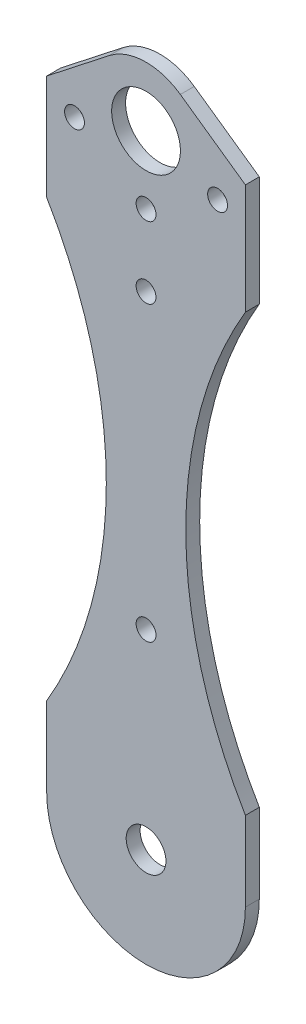
ISO-10303-21;
HEADER;
FILE_DESCRIPTION(('STEP AP214'),'2;1');
FILE_NAME('part.step','',(''),(''),'','','');
FILE_SCHEMA(('AUTOMOTIVE_DESIGN { 1 0 10303 214 1 1 1 1 }'));
ENDSEC;
DATA;
#1=APPLICATION_CONTEXT('core data for automotive mechanical design processes');
#2=APPLICATION_PROTOCOL_DEFINITION('international standard','automotive_design',2000,#1);
#3=PRODUCT_CONTEXT('',#1,'mechanical');
#4=PRODUCT('Part','Part','',(#3));
#5=PRODUCT_RELATED_PRODUCT_CATEGORY('part','',(#4));
#6=PRODUCT_DEFINITION_FORMATION('','',#4);
#7=PRODUCT_DEFINITION_CONTEXT('part definition',#1,'design');
#8=PRODUCT_DEFINITION('design','',#6,#7);
#9=PRODUCT_DEFINITION_SHAPE('','',#8);
#10=(LENGTH_UNIT() NAMED_UNIT(*) SI_UNIT(.MILLI.,.METRE.));
#11=(NAMED_UNIT(*) PLANE_ANGLE_UNIT() SI_UNIT($,.RADIAN.));
#12=(NAMED_UNIT(*) SI_UNIT($,.STERADIAN.) SOLID_ANGLE_UNIT());
#13=UNCERTAINTY_MEASURE_WITH_UNIT(LENGTH_MEASURE(1.E-05),#10,'distance_accuracy_value','');
#14=(GEOMETRIC_REPRESENTATION_CONTEXT(3) GLOBAL_UNCERTAINTY_ASSIGNED_CONTEXT((#13)) GLOBAL_UNIT_ASSIGNED_CONTEXT((#10,
#11,#12)) REPRESENTATION_CONTEXT('',''));
#15=CARTESIAN_POINT('',(0.,0.,0.));
#16=DIRECTION('',(0.,0.,1.));
#17=DIRECTION('',(1.,0.,0.));
#18=AXIS2_PLACEMENT_3D('',#15,#16,#17);
#19=CARTESIAN_POINT('',(-31.75,0.,4.445));
#20=DIRECTION('',(1.,0.,0.));
#21=DIRECTION('',(0.,1.,0.));
#22=AXIS2_PLACEMENT_3D('',#19,#20,#21);
#23=PLANE('',#22);
#24=DIRECTION('',(0.,0.,-1.));
#25=VECTOR('',#24,1.);
#26=CARTESIAN_POINT('',(-31.75,86.0944421154926,4.445));
#27=LINE('',#26,#25);
#28=CARTESIAN_POINT('',(-31.75,86.0944421154926,4.445));
#29=VERTEX_POINT('',#28);
#30=CARTESIAN_POINT('',(-31.75,86.0944421154926,0.));
#31=VERTEX_POINT('',#30);
#32=EDGE_CURVE('E255',#29,#31,#27,.T.);
#33=ORIENTED_EDGE('',*,*,#32,.T.);
#34=DIRECTION('',(0.,-1.,0.));
#35=VECTOR('',#34,1.);
#36=CARTESIAN_POINT('',(-31.75,0.,0.));
#37=LINE('',#36,#35);
#38=CARTESIAN_POINT('',(-31.75,52.48275,0.));
#39=VERTEX_POINT('',#38);
#40=EDGE_CURVE('E159',#31,#39,#37,.T.);
#41=ORIENTED_EDGE('',*,*,#40,.T.);
#42=DIRECTION('',(0.,0.,-1.));
#43=VECTOR('',#42,1.);
#44=CARTESIAN_POINT('',(-31.75,52.48275,4.445));
#45=LINE('',#44,#43);
#46=CARTESIAN_POINT('',(-31.75,52.48275,4.445));
#47=VERTEX_POINT('',#46);
#48=EDGE_CURVE('E116',#47,#39,#45,.T.);
#49=ORIENTED_EDGE('',*,*,#48,.F.);
#50=DIRECTION('',(0.,-1.,0.));
#51=VECTOR('',#50,1.);
#52=CARTESIAN_POINT('',(-31.75,0.,4.445));
#53=LINE('',#52,#51);
#54=EDGE_CURVE('E124',#29,#47,#53,.T.);
#55=ORIENTED_EDGE('',*,*,#54,.F.);
#56=EDGE_LOOP('',(#33,#41,#49,#55));
#57=FACE_BOUND('',#56,.T.);
#58=ADVANCED_FACE('F37',(#57),#23,.F.);
#59=CARTESIAN_POINT('',(31.75,0.,4.445));
#60=DIRECTION('',(1.,0.,0.));
#61=DIRECTION('',(0.,1.,0.));
#62=AXIS2_PLACEMENT_3D('',#59,#60,#61);
#63=PLANE('',#62);
#64=DIRECTION('',(0.,-1.,0.));
#65=VECTOR('',#64,1.);
#66=CARTESIAN_POINT('',(31.75,0.,0.));
#67=LINE('',#66,#65);
#68=CARTESIAN_POINT('',(31.75,-86.7727499999999,0.));
#69=VERTEX_POINT('',#68);
#70=CARTESIAN_POINT('',(31.75,-112.17275,0.));
#71=VERTEX_POINT('',#70);
#72=EDGE_CURVE('E152',#69,#71,#67,.T.);
#73=ORIENTED_EDGE('',*,*,#72,.F.);
#74=DIRECTION('',(0.,0.,-1.));
#75=VECTOR('',#74,1.);
#76=CARTESIAN_POINT('',(31.75,-86.7727499999999,4.445));
#77=LINE('',#76,#75);
#78=CARTESIAN_POINT('',(31.75,-86.7727499999999,4.445));
#79=VERTEX_POINT('',#78);
#80=EDGE_CURVE('E11',#79,#69,#77,.T.);
#81=ORIENTED_EDGE('',*,*,#80,.F.);
#82=DIRECTION('',(0.,-1.,0.));
#83=VECTOR('',#82,1.);
#84=CARTESIAN_POINT('',(31.75,0.,4.445));
#85=LINE('',#84,#83);
#86=CARTESIAN_POINT('',(31.75,-112.17275,4.445));
#87=VERTEX_POINT('',#86);
#88=EDGE_CURVE('E284',#79,#87,#85,.T.);
#89=ORIENTED_EDGE('',*,*,#88,.T.);
#90=DIRECTION('',(0.,0.,-1.));
#91=VECTOR('',#90,1.);
#92=CARTESIAN_POINT('',(31.75,-112.17275,4.445));
#93=LINE('',#92,#91);
#94=EDGE_CURVE('E87',#87,#71,#93,.T.);
#95=ORIENTED_EDGE('',*,*,#94,.T.);
#96=EDGE_LOOP('',(#73,#81,#89,#95));
#97=FACE_BOUND('',#96,.T.);
#98=ADVANCED_FACE('F183',(#97),#63,.T.);
#99=CARTESIAN_POINT('',(149.469713125,-17.1449999999999,4.445));
#100=DIRECTION('',(0.,0.,-1.));
#101=DIRECTION('',(-1.,0.,0.));
#102=AXIS2_PLACEMENT_3D('',#99,#100,#101);
#103=CYLINDRICAL_SURFACE('',#102,136.769713125);
#104=CARTESIAN_POINT('',(149.469713125,-17.1449999999999,0.));
#105=DIRECTION('',(0.,0.,1.));
#106=DIRECTION('',(1.,0.,0.));
#107=AXIS2_PLACEMENT_3D('',#104,#105,#106);
#108=CIRCLE('',#107,136.769713125);
#109=CARTESIAN_POINT('',(31.75,52.48275,0.));
#110=VERTEX_POINT('',#109);
#111=EDGE_CURVE('E155',#69,#110,#108,.F.);
#112=ORIENTED_EDGE('',*,*,#111,.T.);
#113=DIRECTION('',(0.,0.,-1.));
#114=VECTOR('',#113,1.);
#115=CARTESIAN_POINT('',(31.75,52.48275,4.445));
#116=LINE('',#115,#114);
#117=CARTESIAN_POINT('',(31.75,52.48275,4.445));
#118=VERTEX_POINT('',#117);
#119=EDGE_CURVE('E45',#118,#110,#116,.T.);
#120=ORIENTED_EDGE('',*,*,#119,.F.);
#121=CARTESIAN_POINT('',(149.469713125,-17.1449999999999,4.445));
#122=DIRECTION('',(0.,0.,1.));
#123=DIRECTION('',(1.,0.,0.));
#124=AXIS2_PLACEMENT_3D('',#121,#122,#123);
#125=CIRCLE('',#124,136.769713125);
#126=EDGE_CURVE('E285',#79,#118,#125,.F.);
#127=ORIENTED_EDGE('',*,*,#126,.F.);
#128=ORIENTED_EDGE('',*,*,#80,.T.);
#129=EDGE_LOOP('',(#112,#120,#127,#128));
#130=FACE_BOUND('',#129,.T.);
#131=ADVANCED_FACE('F179',(#130),#103,.F.);
#132=DIRECTION('',(0.,0.,-1.));
#133=VECTOR('',#132,1.);
#134=CARTESIAN_POINT('',(31.75,87.7278500626216,4.445));
#135=LINE('',#134,#133);
#136=CARTESIAN_POINT('',(31.75,87.7278500626216,4.445));
#137=VERTEX_POINT('',#136);
#138=CARTESIAN_POINT('',(31.75,87.7278500626216,0.));
#139=VERTEX_POINT('',#138);
#140=EDGE_CURVE('E238',#137,#139,#135,.T.);
#141=ORIENTED_EDGE('',*,*,#140,.F.);
#142=EDGE_CURVE('E132',#137,#118,#85,.T.);
#143=ORIENTED_EDGE('',*,*,#142,.T.);
#144=ORIENTED_EDGE('',*,*,#119,.T.);
#145=EDGE_CURVE('E156',#139,#110,#67,.T.);
#146=ORIENTED_EDGE('',*,*,#145,.F.);
#147=EDGE_LOOP('',(#141,#143,#144,#146));
#148=FACE_BOUND('',#147,.T.);
#149=ADVANCED_FACE('F173',(#148),#63,.T.);
#150=CARTESIAN_POINT('',(-149.469713125,-17.145,4.445));
#151=DIRECTION('',(0.,0.,-1.));
#152=DIRECTION('',(-1.,0.,0.));
#153=AXIS2_PLACEMENT_3D('',#150,#151,#152);
#154=CYLINDRICAL_SURFACE('',#153,136.769713125);
#155=CARTESIAN_POINT('',(-149.469713125,-17.145,0.));
#156=DIRECTION('',(0.,0.,1.));
#157=DIRECTION('',(1.,0.,0.));
#158=AXIS2_PLACEMENT_3D('',#155,#156,#157);
#159=CIRCLE('',#158,136.769713125);
#160=CARTESIAN_POINT('',(-31.75,-86.77275,0.));
#161=VERTEX_POINT('',#160);
#162=EDGE_CURVE('E112',#161,#39,#159,.T.);
#163=ORIENTED_EDGE('',*,*,#162,.F.);
#164=DIRECTION('',(0.,0.,-1.));
#165=VECTOR('',#164,1.);
#166=CARTESIAN_POINT('',(-31.75,-86.77275,4.445));
#167=LINE('',#166,#165);
#168=CARTESIAN_POINT('',(-31.75,-86.77275,4.445));
#169=VERTEX_POINT('',#168);
#170=EDGE_CURVE('E105',#169,#161,#167,.T.);
#171=ORIENTED_EDGE('',*,*,#170,.F.);
#172=CARTESIAN_POINT('',(-149.469713125,-17.145,4.445));
#173=DIRECTION('',(0.,0.,1.));
#174=DIRECTION('',(1.,0.,0.));
#175=AXIS2_PLACEMENT_3D('',#172,#173,#174);
#176=CIRCLE('',#175,136.769713125);
#177=EDGE_CURVE('E110',#169,#47,#176,.T.);
#178=ORIENTED_EDGE('',*,*,#177,.T.);
#179=ORIENTED_EDGE('',*,*,#48,.T.);
#180=EDGE_LOOP('',(#163,#171,#178,#179));
#181=FACE_BOUND('',#180,.T.);
#182=ADVANCED_FACE('F107',(#181),#154,.F.);
#183=CARTESIAN_POINT('',(-31.75,-112.17275,0.));
#184=VERTEX_POINT('',#183);
#185=EDGE_CURVE('E161',#161,#184,#37,.T.);
#186=ORIENTED_EDGE('',*,*,#185,.T.);
#187=DIRECTION('',(0.,0.,-1.));
#188=VECTOR('',#187,1.);
#189=CARTESIAN_POINT('',(-31.75,-112.17275,4.445));
#190=LINE('',#189,#188);
#191=CARTESIAN_POINT('',(-31.75,-112.17275,4.445));
#192=VERTEX_POINT('',#191);
#193=EDGE_CURVE('E117',#192,#184,#190,.T.);
#194=ORIENTED_EDGE('',*,*,#193,.F.);
#195=EDGE_CURVE('E120',#169,#192,#53,.T.);
#196=ORIENTED_EDGE('',*,*,#195,.F.);
#197=ORIENTED_EDGE('',*,*,#170,.T.);
#198=EDGE_LOOP('',(#186,#194,#196,#197));
#199=FACE_BOUND('',#198,.T.);
#200=ADVANCED_FACE('F121',(#199),#23,.F.);
#201=CARTESIAN_POINT('',(22.86,79.1527500000001,4.445));
#202=DIRECTION('',(0.,0.,-1.));
#203=DIRECTION('',(-1.,0.,0.));
#204=AXIS2_PLACEMENT_3D('',#201,#202,#203);
#205=CYLINDRICAL_SURFACE('',#204,3.175);
#206=CARTESIAN_POINT('',(22.86,79.1527500000001,4.445));
#207=DIRECTION('',(0.,0.,1.));
#208=DIRECTION('',(1.,0.,0.));
#209=AXIS2_PLACEMENT_3D('',#206,#207,#208);
#210=CIRCLE('',#209,3.175);
#211=CARTESIAN_POINT('',(26.035,79.1527500000001,4.445));
#212=VERTEX_POINT('',#211);
#213=EDGE_CURVE('E281',#212,#212,#210,.T.);
#214=ORIENTED_EDGE('',*,*,#213,.T.);
#215=EDGE_LOOP('',(#214));
#216=FACE_BOUND('',#215,.T.);
#217=CARTESIAN_POINT('',(22.86,79.1527500000001,0.));
#218=DIRECTION('',(0.,0.,1.));
#219=DIRECTION('',(1.,0.,0.));
#220=AXIS2_PLACEMENT_3D('',#217,#218,#219);
#221=CIRCLE('',#220,3.175);
#222=CARTESIAN_POINT('',(26.035,79.1527500000001,0.));
#223=VERTEX_POINT('',#222);
#224=EDGE_CURVE('E149',#223,#223,#221,.T.);
#225=ORIENTED_EDGE('',*,*,#224,.F.);
#226=EDGE_LOOP('',(#225));
#227=FACE_BOUND('',#226,.T.);
#228=ADVANCED_FACE('F201',(#216,#227),#205,.F.);
#229=CARTESIAN_POINT('',(-22.86,79.1527500000001,4.445));
#230=DIRECTION('',(0.,0.,-1.));
#231=DIRECTION('',(-1.,0.,0.));
#232=AXIS2_PLACEMENT_3D('',#229,#230,#231);
#233=CYLINDRICAL_SURFACE('',#232,3.175);
#234=CARTESIAN_POINT('',(-22.86,79.1527500000001,4.445));
#235=DIRECTION('',(0.,0.,1.));
#236=DIRECTION('',(1.,0.,0.));
#237=AXIS2_PLACEMENT_3D('',#234,#235,#236);
#238=CIRCLE('',#237,3.175);
#239=CARTESIAN_POINT('',(-19.685,79.1527500000001,4.445));
#240=VERTEX_POINT('',#239);
#241=EDGE_CURVE('E278',#240,#240,#238,.T.);
#242=ORIENTED_EDGE('',*,*,#241,.T.);
#243=EDGE_LOOP('',(#242));
#244=FACE_BOUND('',#243,.T.);
#245=CARTESIAN_POINT('',(-22.86,79.1527500000001,0.));
#246=DIRECTION('',(0.,0.,1.));
#247=DIRECTION('',(1.,0.,0.));
#248=AXIS2_PLACEMENT_3D('',#245,#246,#247);
#249=CIRCLE('',#248,3.175);
#250=CARTESIAN_POINT('',(-19.685,79.1527500000001,0.));
#251=VERTEX_POINT('',#250);
#252=EDGE_CURVE('E146',#251,#251,#249,.T.);
#253=ORIENTED_EDGE('',*,*,#252,.F.);
#254=EDGE_LOOP('',(#253));
#255=FACE_BOUND('',#254,.T.);
#256=ADVANCED_FACE('F305',(#244,#255),#233,.F.);
#257=CARTESIAN_POINT('',(0.,65.1827500000001,4.445));
#258=DIRECTION('',(0.,0.,-1.));
#259=DIRECTION('',(-1.,0.,0.));
#260=AXIS2_PLACEMENT_3D('',#257,#258,#259);
#261=CYLINDRICAL_SURFACE('',#260,3.175);
#262=CARTESIAN_POINT('',(0.,65.1827500000001,4.445));
#263=DIRECTION('',(0.,0.,1.));
#264=DIRECTION('',(1.,0.,0.));
#265=AXIS2_PLACEMENT_3D('',#262,#263,#264);
#266=CIRCLE('',#265,3.175);
#267=CARTESIAN_POINT('',(3.175,65.1827500000001,4.445));
#268=VERTEX_POINT('',#267);
#269=EDGE_CURVE('E275',#268,#268,#266,.T.);
#270=ORIENTED_EDGE('',*,*,#269,.T.);
#271=EDGE_LOOP('',(#270));
#272=FACE_BOUND('',#271,.T.);
#273=CARTESIAN_POINT('',(0.,65.1827500000001,0.));
#274=DIRECTION('',(0.,0.,1.));
#275=DIRECTION('',(1.,0.,0.));
#276=AXIS2_PLACEMENT_3D('',#273,#274,#275);
#277=CIRCLE('',#276,3.175);
#278=CARTESIAN_POINT('',(3.175,65.1827500000001,0.));
#279=VERTEX_POINT('',#278);
#280=EDGE_CURVE('E143',#279,#279,#277,.T.);
#281=ORIENTED_EDGE('',*,*,#280,.F.);
#282=EDGE_LOOP('',(#281));
#283=FACE_BOUND('',#282,.T.);
#284=ADVANCED_FACE('F312',(#272,#283),#261,.F.);
#285=CARTESIAN_POINT('',(0.,86.77275,4.445));
#286=DIRECTION('',(0.,0.,-1.));
#287=DIRECTION('',(-1.,0.,0.));
#288=AXIS2_PLACEMENT_3D('',#285,#286,#287);
#289=CYLINDRICAL_SURFACE('',#288,10.9855);
#290=CARTESIAN_POINT('',(0.,86.77275,4.445));
#291=DIRECTION('',(0.,0.,1.));
#292=DIRECTION('',(1.,0.,0.));
#293=AXIS2_PLACEMENT_3D('',#290,#291,#292);
#294=CIRCLE('',#293,10.9855);
#295=CARTESIAN_POINT('',(10.9855,86.77275,4.445));
#296=VERTEX_POINT('',#295);
#297=EDGE_CURVE('E272',#296,#296,#294,.T.);
#298=ORIENTED_EDGE('',*,*,#297,.T.);
#299=EDGE_LOOP('',(#298));
#300=FACE_BOUND('',#299,.T.);
#301=CARTESIAN_POINT('',(0.,86.77275,0.));
#302=DIRECTION('',(0.,0.,1.));
#303=DIRECTION('',(1.,0.,0.));
#304=AXIS2_PLACEMENT_3D('',#301,#302,#303);
#305=CIRCLE('',#304,10.9855);
#306=CARTESIAN_POINT('',(10.9855,86.77275,0.));
#307=VERTEX_POINT('',#306);
#308=EDGE_CURVE('E139',#307,#307,#305,.T.);
#309=ORIENTED_EDGE('',*,*,#308,.F.);
#310=EDGE_LOOP('',(#309));
#311=FACE_BOUND('',#310,.T.);
#312=ADVANCED_FACE('F317',(#300,#311),#289,.F.);
#313=CARTESIAN_POINT('',(0.,-112.17275,4.445));
#314=DIRECTION('',(0.,0.,-1.));
#315=DIRECTION('',(-1.,0.,0.));
#316=AXIS2_PLACEMENT_3D('',#313,#314,#315);
#317=CYLINDRICAL_SURFACE('',#316,6.35);
#318=CARTESIAN_POINT('',(0.,-112.17275,4.445));
#319=DIRECTION('',(0.,0.,1.));
#320=DIRECTION('',(1.,0.,0.));
#321=AXIS2_PLACEMENT_3D('',#318,#319,#320);
#322=CIRCLE('',#321,6.35);
#323=CARTESIAN_POINT('',(6.35000000000002,-112.17275,4.445));
#324=VERTEX_POINT('',#323);
#325=EDGE_CURVE('E165',#324,#324,#322,.T.);
#326=ORIENTED_EDGE('',*,*,#325,.T.);
#327=EDGE_LOOP('',(#326));
#328=FACE_BOUND('',#327,.T.);
#329=CARTESIAN_POINT('',(0.,-112.17275,0.));
#330=DIRECTION('',(0.,0.,1.));
#331=DIRECTION('',(1.,0.,0.));
#332=AXIS2_PLACEMENT_3D('',#329,#330,#331);
#333=CIRCLE('',#332,6.35);
#334=CARTESIAN_POINT('',(6.35000000000002,-112.17275,0.));
#335=VERTEX_POINT('',#334);
#336=EDGE_CURVE('E136',#335,#335,#333,.T.);
#337=ORIENTED_EDGE('',*,*,#336,.F.);
#338=EDGE_LOOP('',(#337));
#339=FACE_BOUND('',#338,.T.);
#340=ADVANCED_FACE('F39',(#328,#339),#317,.F.);
#341=CARTESIAN_POINT('',(0.,-112.17275,4.445));
#342=DIRECTION('',(0.,0.,-1.));
#343=DIRECTION('',(-1.,0.,0.));
#344=AXIS2_PLACEMENT_3D('',#341,#342,#343);
#345=CYLINDRICAL_SURFACE('',#344,31.75);
#346=CARTESIAN_POINT('',(0.,-112.17275,0.));
#347=DIRECTION('',(0.,0.,1.));
#348=DIRECTION('',(1.,0.,0.));
#349=AXIS2_PLACEMENT_3D('',#346,#347,#348);
#350=CIRCLE('',#349,31.75);
#351=EDGE_CURVE('E163',#184,#71,#350,.T.);
#352=ORIENTED_EDGE('',*,*,#351,.T.);
#353=ORIENTED_EDGE('',*,*,#94,.F.);
#354=CARTESIAN_POINT('',(0.,-112.17275,4.445));
#355=DIRECTION('',(0.,0.,1.));
#356=DIRECTION('',(1.,0.,0.));
#357=AXIS2_PLACEMENT_3D('',#354,#355,#356);
#358=CIRCLE('',#357,31.75);
#359=EDGE_CURVE('E61',#192,#87,#358,.T.);
#360=ORIENTED_EDGE('',*,*,#359,.F.);
#361=ORIENTED_EDGE('',*,*,#193,.T.);
#362=EDGE_LOOP('',(#352,#353,#360,#361));
#363=FACE_BOUND('',#362,.T.);
#364=ADVANCED_FACE('F203',(#363),#345,.T.);
#365=CARTESIAN_POINT('',(0.,0.,4.445));
#366=DIRECTION('',(0.,0.,1.));
#367=DIRECTION('',(1.,0.,0.));
#368=AXIS2_PLACEMENT_3D('',#365,#366,#367);
#369=PLANE('',#368);
#370=DIRECTION('',(-0.817874399318846,0.575396790865953,0.));
#371=VECTOR('',#370,1.);
#372=CARTESIAN_POINT('',(51.7967650011085,73.6244079467071,4.445));
#373=LINE('',#372,#371);
#374=CARTESIAN_POINT('',(10.9613088659964,102.353257307024,4.445));
#375=VERTEX_POINT('',#374);
#376=EDGE_CURVE('E249',#137,#375,#373,.T.);
#377=ORIENTED_EDGE('',*,*,#376,.T.);
#378=CARTESIAN_POINT('',(0.,86.77275,4.445));
#379=DIRECTION('',(0.,0.,-1.));
#380=DIRECTION('',(-1.,0.,0.));
#381=AXIS2_PLACEMENT_3D('',#378,#379,#380);
#382=CIRCLE('',#381,19.05);
#383=CARTESIAN_POINT('',(-11.7503407514417,101.767148695013,4.445));
#384=VERTEX_POINT('',#383);
#385=EDGE_CURVE('E240',#384,#375,#382,.T.);
#386=ORIENTED_EDGE('',*,*,#385,.F.);
#387=DIRECTION('',(0.787107543045302,0.616815787477257,0.));
#388=VECTOR('',#387,1.);
#389=CARTESIAN_POINT('',(-53.8785420272322,68.7534393556382,4.445));
#390=LINE('',#389,#388);
#391=EDGE_CURVE('E298',#29,#384,#390,.T.);
#392=ORIENTED_EDGE('',*,*,#391,.F.);
#393=ORIENTED_EDGE('',*,*,#54,.T.);
#394=ORIENTED_EDGE('',*,*,#177,.F.);
#395=ORIENTED_EDGE('',*,*,#195,.T.);
#396=ORIENTED_EDGE('',*,*,#359,.T.);
#397=ORIENTED_EDGE('',*,*,#88,.F.);
#398=ORIENTED_EDGE('',*,*,#126,.T.);
#399=ORIENTED_EDGE('',*,*,#142,.F.);
#400=EDGE_LOOP('',(#377,#386,#392,#393,#394,#395,#396,#397,#398,#399));
#401=FACE_BOUND('',#400,.T.);
#402=CARTESIAN_POINT('',(0.,-51.21275,4.445));
#403=DIRECTION('',(0.,0.,1.));
#404=DIRECTION('',(1.,0.,0.));
#405=AXIS2_PLACEMENT_3D('',#402,#403,#404);
#406=CIRCLE('',#405,3.175);
#407=CARTESIAN_POINT('',(3.175,-51.21275,4.445));
#408=VERTEX_POINT('',#407);
#409=EDGE_CURVE('E253',#408,#408,#406,.T.);
#410=ORIENTED_EDGE('',*,*,#409,.F.);
#411=EDGE_LOOP('',(#410));
#412=FACE_BOUND('',#411,.T.);
#413=CARTESIAN_POINT('',(0.,42.3227500000001,4.445));
#414=DIRECTION('',(0.,0.,1.));
#415=DIRECTION('',(1.,0.,0.));
#416=AXIS2_PLACEMENT_3D('',#413,#414,#415);
#417=CIRCLE('',#416,3.175);
#418=CARTESIAN_POINT('',(3.175,42.3227500000001,4.445));
#419=VERTEX_POINT('',#418);
#420=EDGE_CURVE('E263',#419,#419,#417,.T.);
#421=ORIENTED_EDGE('',*,*,#420,.F.);
#422=EDGE_LOOP('',(#421));
#423=FACE_BOUND('',#422,.T.);
#424=ORIENTED_EDGE('',*,*,#325,.F.);
#425=EDGE_LOOP('',(#424));
#426=FACE_BOUND('',#425,.T.);
#427=ORIENTED_EDGE('',*,*,#297,.F.);
#428=EDGE_LOOP('',(#427));
#429=FACE_BOUND('',#428,.T.);
#430=ORIENTED_EDGE('',*,*,#269,.F.);
#431=EDGE_LOOP('',(#430));
#432=FACE_BOUND('',#431,.T.);
#433=ORIENTED_EDGE('',*,*,#241,.F.);
#434=EDGE_LOOP('',(#433));
#435=FACE_BOUND('',#434,.T.);
#436=ORIENTED_EDGE('',*,*,#213,.F.);
#437=EDGE_LOOP('',(#436));
#438=FACE_BOUND('',#437,.T.);
#439=ADVANCED_FACE('F126',(#401,#412,#423,#426,#429,#432,#435,#438),#369,.T.);
#440=CARTESIAN_POINT('',(0.,0.,0.));
#441=DIRECTION('',(0.,0.,1.));
#442=DIRECTION('',(1.,0.,0.));
#443=AXIS2_PLACEMENT_3D('',#440,#441,#442);
#444=PLANE('',#443);
#445=CARTESIAN_POINT('',(0.,-51.21275,0.));
#446=DIRECTION('',(0.,0.,1.));
#447=DIRECTION('',(1.,0.,0.));
#448=AXIS2_PLACEMENT_3D('',#445,#446,#447);
#449=CIRCLE('',#448,3.175);
#450=CARTESIAN_POINT('',(3.175,-51.21275,0.));
#451=VERTEX_POINT('',#450);
#452=EDGE_CURVE('E260',#451,#451,#449,.T.);
#453=ORIENTED_EDGE('',*,*,#452,.T.);
#454=EDGE_LOOP('',(#453));
#455=FACE_BOUND('',#454,.T.);
#456=CARTESIAN_POINT('',(0.,42.3227500000001,0.));
#457=DIRECTION('',(0.,0.,1.));
#458=DIRECTION('',(1.,0.,0.));
#459=AXIS2_PLACEMENT_3D('',#456,#457,#458);
#460=CIRCLE('',#459,3.175);
#461=CARTESIAN_POINT('',(3.175,42.3227500000001,0.));
#462=VERTEX_POINT('',#461);
#463=EDGE_CURVE('E140',#462,#462,#460,.T.);
#464=ORIENTED_EDGE('',*,*,#463,.T.);
#465=EDGE_LOOP('',(#464));
#466=FACE_BOUND('',#465,.T.);
#467=ORIENTED_EDGE('',*,*,#336,.T.);
#468=EDGE_LOOP('',(#467));
#469=FACE_BOUND('',#468,.T.);
#470=ORIENTED_EDGE('',*,*,#308,.T.);
#471=EDGE_LOOP('',(#470));
#472=FACE_BOUND('',#471,.T.);
#473=ORIENTED_EDGE('',*,*,#280,.T.);
#474=EDGE_LOOP('',(#473));
#475=FACE_BOUND('',#474,.T.);
#476=ORIENTED_EDGE('',*,*,#252,.T.);
#477=EDGE_LOOP('',(#476));
#478=FACE_BOUND('',#477,.T.);
#479=ORIENTED_EDGE('',*,*,#224,.T.);
#480=EDGE_LOOP('',(#479));
#481=FACE_BOUND('',#480,.T.);
#482=CARTESIAN_POINT('',(0.,86.77275,0.));
#483=DIRECTION('',(0.,0.,-1.));
#484=DIRECTION('',(-1.,0.,0.));
#485=AXIS2_PLACEMENT_3D('',#482,#483,#484);
#486=CIRCLE('',#485,19.05);
#487=CARTESIAN_POINT('',(-11.7503407514417,101.767148695013,0.));
#488=VERTEX_POINT('',#487);
#489=CARTESIAN_POINT('',(10.9613088659964,102.353257307024,0.));
#490=VERTEX_POINT('',#489);
#491=EDGE_CURVE('E52',#488,#490,#486,.T.);
#492=ORIENTED_EDGE('',*,*,#491,.T.);
#493=DIRECTION('',(-0.817874399318846,0.575396790865953,0.));
#494=VECTOR('',#493,1.);
#495=CARTESIAN_POINT('',(51.7967650011085,73.6244079467071,0.));
#496=LINE('',#495,#494);
#497=EDGE_CURVE('E235',#139,#490,#496,.T.);
#498=ORIENTED_EDGE('',*,*,#497,.F.);
#499=ORIENTED_EDGE('',*,*,#145,.T.);
#500=ORIENTED_EDGE('',*,*,#111,.F.);
#501=ORIENTED_EDGE('',*,*,#72,.T.);
#502=ORIENTED_EDGE('',*,*,#351,.F.);
#503=ORIENTED_EDGE('',*,*,#185,.F.);
#504=ORIENTED_EDGE('',*,*,#162,.T.);
#505=ORIENTED_EDGE('',*,*,#40,.F.);
#506=DIRECTION('',(0.787107543045302,0.616815787477257,0.));
#507=VECTOR('',#506,1.);
#508=CARTESIAN_POINT('',(-53.8785420272322,68.7534393556382,0.));
#509=LINE('',#508,#507);
#510=EDGE_CURVE('E241',#31,#488,#509,.T.);
#511=ORIENTED_EDGE('',*,*,#510,.T.);
#512=EDGE_LOOP('',(#492,#498,#499,#500,#501,#502,#503,#504,#505,#511));
#513=FACE_BOUND('',#512,.T.);
#514=ADVANCED_FACE('F181',(#455,#466,#469,#472,#475,#478,#481,#513),#444,.F.);
#515=CARTESIAN_POINT('',(0.,42.3227500000001,0.));
#516=DIRECTION('',(0.,0.,1.));
#517=DIRECTION('',(1.,0.,0.));
#518=AXIS2_PLACEMENT_3D('',#515,#516,#517);
#519=CYLINDRICAL_SURFACE('',#518,3.175);
#520=ORIENTED_EDGE('',*,*,#463,.F.);
#521=EDGE_LOOP('',(#520));
#522=FACE_BOUND('',#521,.T.);
#523=ORIENTED_EDGE('',*,*,#420,.T.);
#524=EDGE_LOOP('',(#523));
#525=FACE_BOUND('',#524,.T.);
#526=ADVANCED_FACE('F209',(#522,#525),#519,.F.);
#527=CARTESIAN_POINT('',(0.,-51.21275,0.));
#528=DIRECTION('',(0.,0.,1.));
#529=DIRECTION('',(1.,0.,0.));
#530=AXIS2_PLACEMENT_3D('',#527,#528,#529);
#531=CYLINDRICAL_SURFACE('',#530,3.175);
#532=ORIENTED_EDGE('',*,*,#452,.F.);
#533=EDGE_LOOP('',(#532));
#534=FACE_BOUND('',#533,.T.);
#535=ORIENTED_EDGE('',*,*,#409,.T.);
#536=EDGE_LOOP('',(#535));
#537=FACE_BOUND('',#536,.T.);
#538=ADVANCED_FACE('F215',(#534,#537),#531,.F.);
#539=CARTESIAN_POINT('',(0.,86.77275,4.445));
#540=DIRECTION('',(0.,0.,-1.));
#541=DIRECTION('',(-1.,0.,0.));
#542=AXIS2_PLACEMENT_3D('',#539,#540,#541);
#543=CYLINDRICAL_SURFACE('',#542,19.05);
#544=ORIENTED_EDGE('',*,*,#491,.F.);
#545=DIRECTION('',(0.,0.,-1.));
#546=VECTOR('',#545,1.);
#547=CARTESIAN_POINT('',(-11.7503407514417,101.767148695013,4.445));
#548=LINE('',#547,#546);
#549=EDGE_CURVE('E258',#384,#488,#548,.T.);
#550=ORIENTED_EDGE('',*,*,#549,.F.);
#551=ORIENTED_EDGE('',*,*,#385,.T.);
#552=DIRECTION('',(0.,0.,-1.));
#553=VECTOR('',#552,1.);
#554=CARTESIAN_POINT('',(10.9613088659964,102.353257307024,4.445));
#555=LINE('',#554,#553);
#556=EDGE_CURVE('E237',#375,#490,#555,.T.);
#557=ORIENTED_EDGE('',*,*,#556,.T.);
#558=EDGE_LOOP('',(#544,#550,#551,#557));
#559=FACE_BOUND('',#558,.T.);
#560=ADVANCED_FACE('F219',(#559),#543,.T.);
#561=CARTESIAN_POINT('',(51.7967650011085,73.6244079467071,4.445));
#562=DIRECTION('',(-0.575396790865953,-0.817874399318846,0.));
#563=DIRECTION('',(0.817874399318846,-0.575396790865953,0.));
#564=AXIS2_PLACEMENT_3D('',#561,#562,#563);
#565=PLANE('',#564);
#566=ORIENTED_EDGE('',*,*,#497,.T.);
#567=ORIENTED_EDGE('',*,*,#556,.F.);
#568=ORIENTED_EDGE('',*,*,#376,.F.);
#569=ORIENTED_EDGE('',*,*,#140,.T.);
#570=EDGE_LOOP('',(#566,#567,#568,#569));
#571=FACE_BOUND('',#570,.T.);
#572=ADVANCED_FACE('F223',(#571),#565,.F.);
#573=CARTESIAN_POINT('',(-53.8785420272322,68.7534393556382,4.445));
#574=DIRECTION('',(-0.616815787477257,0.787107543045302,0.));
#575=DIRECTION('',(-0.787107543045302,-0.616815787477257,0.));
#576=AXIS2_PLACEMENT_3D('',#573,#574,#575);
#577=PLANE('',#576);
#578=ORIENTED_EDGE('',*,*,#510,.F.);
#579=ORIENTED_EDGE('',*,*,#32,.F.);
#580=ORIENTED_EDGE('',*,*,#391,.T.);
#581=ORIENTED_EDGE('',*,*,#549,.T.);
#582=EDGE_LOOP('',(#578,#579,#580,#581));
#583=FACE_BOUND('',#582,.T.);
#584=ADVANCED_FACE('F224',(#583),#577,.T.);
#585=CLOSED_SHELL('',(#58,#98,#131,#149,#182,#200,#228,#256,#284,#312,#340,#364,#439,#514,#526,
#538,#560,#572,#584));
#586=MANIFOLD_SOLID_BREP('B2',#585);
#587=ADVANCED_BREP_SHAPE_REPRESENTATION('',(#18,#586),#14);
#588=SHAPE_DEFINITION_REPRESENTATION(#9,#587);
ENDSEC;
END-ISO-10303-21;
